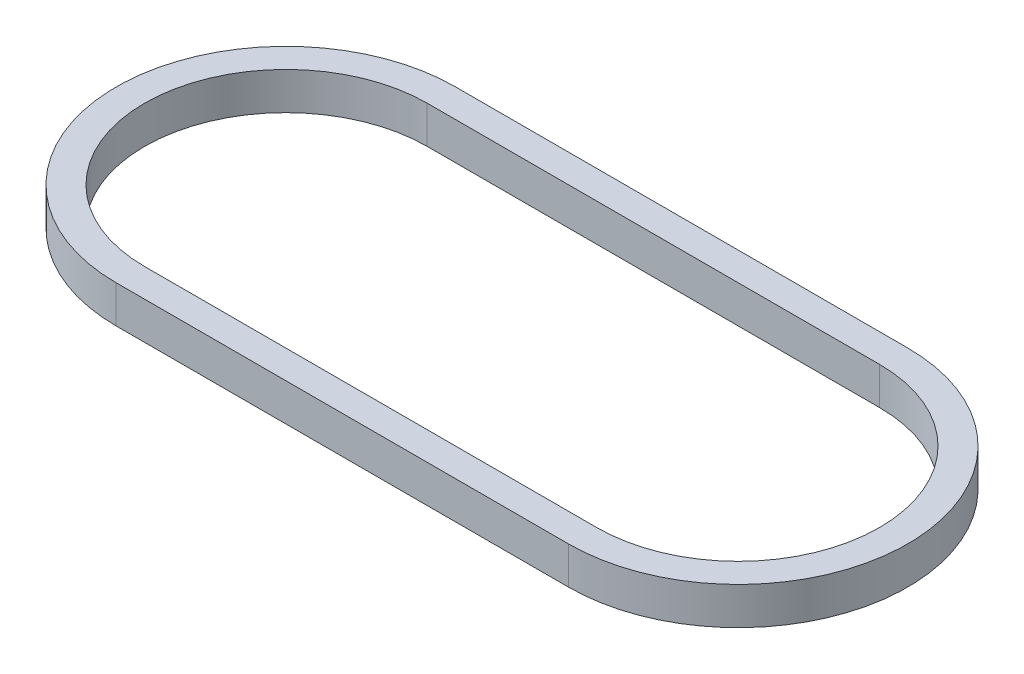
ISO-10303-21;
HEADER;
FILE_DESCRIPTION(('STEP AP214'),'2;1');
FILE_NAME('part.step','',(''),(''),'','','');
FILE_SCHEMA(('AUTOMOTIVE_DESIGN { 1 0 10303 214 1 1 1 1 }'));
ENDSEC;
DATA;
#1=APPLICATION_CONTEXT('core data for automotive mechanical design processes');
#2=APPLICATION_PROTOCOL_DEFINITION('international standard','automotive_design',2000,#1);
#3=PRODUCT_CONTEXT('',#1,'mechanical');
#4=PRODUCT('Part','Part','',(#3));
#5=PRODUCT_RELATED_PRODUCT_CATEGORY('part','',(#4));
#6=PRODUCT_DEFINITION_FORMATION('','',#4);
#7=PRODUCT_DEFINITION_CONTEXT('part definition',#1,'design');
#8=PRODUCT_DEFINITION('design','',#6,#7);
#9=PRODUCT_DEFINITION_SHAPE('','',#8);
#10=(LENGTH_UNIT() NAMED_UNIT(*) SI_UNIT(.MILLI.,.METRE.));
#11=(NAMED_UNIT(*) PLANE_ANGLE_UNIT() SI_UNIT($,.RADIAN.));
#12=(NAMED_UNIT(*) SI_UNIT($,.STERADIAN.) SOLID_ANGLE_UNIT());
#13=UNCERTAINTY_MEASURE_WITH_UNIT(LENGTH_MEASURE(1.E-05),#10,'distance_accuracy_value','');
#14=(GEOMETRIC_REPRESENTATION_CONTEXT(3) GLOBAL_UNCERTAINTY_ASSIGNED_CONTEXT((#13)) GLOBAL_UNIT_ASSIGNED_CONTEXT((#10,
#11,#12)) REPRESENTATION_CONTEXT('',''));
#15=CARTESIAN_POINT('',(0.,0.,0.));
#16=DIRECTION('',(0.,0.,1.));
#17=DIRECTION('',(1.,0.,0.));
#18=AXIS2_PLACEMENT_3D('',#15,#16,#17);
#19=CARTESIAN_POINT('',(0.,7.7978,35.3387000000112));
#20=DIRECTION('',(0.,0.,-1.));
#21=DIRECTION('',(-1.,0.,0.));
#22=AXIS2_PLACEMENT_3D('',#19,#20,#21);
#23=PLANE('',#22);
#24=DIRECTION('',(1.,0.,0.));
#25=VECTOR('',#24,1.);
#26=CARTESIAN_POINT('',(0.,0.,35.3387000000112));
#27=LINE('',#26,#25);
#28=CARTESIAN_POINT('',(-47.1,0.,35.3387000000112));
#29=VERTEX_POINT('',#28);
#30=CARTESIAN_POINT('',(47.1,0.,35.3387000000112));
#31=VERTEX_POINT('',#30);
#32=EDGE_CURVE('E165',#29,#31,#27,.T.);
#33=ORIENTED_EDGE('',*,*,#32,.T.);
#34=DIRECTION('',(0.,-1.,0.));
#35=VECTOR('',#34,1.);
#36=CARTESIAN_POINT('',(47.1,7.7978,35.3387000000112));
#37=LINE('',#36,#35);
#38=CARTESIAN_POINT('',(47.1,7.7978,35.3387000000112));
#39=VERTEX_POINT('',#38);
#40=EDGE_CURVE('E11',#39,#31,#37,.T.);
#41=ORIENTED_EDGE('',*,*,#40,.F.);
#42=DIRECTION('',(1.,0.,0.));
#43=VECTOR('',#42,1.);
#44=CARTESIAN_POINT('',(0.,7.7978,35.3387000000112));
#45=LINE('',#44,#43);
#46=CARTESIAN_POINT('',(-47.1,7.7978,35.3387000000112));
#47=VERTEX_POINT('',#46);
#48=EDGE_CURVE('E129',#47,#39,#45,.T.);
#49=ORIENTED_EDGE('',*,*,#48,.F.);
#50=DIRECTION('',(0.,-1.,0.));
#51=VECTOR('',#50,1.);
#52=CARTESIAN_POINT('',(-47.1,7.7978,35.3387000000112));
#53=LINE('',#52,#51);
#54=EDGE_CURVE('E173',#47,#29,#53,.T.);
#55=ORIENTED_EDGE('',*,*,#54,.T.);
#56=EDGE_LOOP('',(#33,#41,#49,#55));
#57=FACE_BOUND('',#56,.T.);
#58=ADVANCED_FACE('F51',(#57),#23,.F.);
#59=CARTESIAN_POINT('',(47.1,7.7978,0.));
#60=DIRECTION('',(0.,-1.,0.));
#61=DIRECTION('',(0.,0.,-1.));
#62=AXIS2_PLACEMENT_3D('',#59,#60,#61);
#63=CYLINDRICAL_SURFACE('',#62,35.3387000000112);
#64=CARTESIAN_POINT('',(47.1,0.,0.));
#65=DIRECTION('',(0.,1.,0.));
#66=DIRECTION('',(0.,0.,1.));
#67=AXIS2_PLACEMENT_3D('',#64,#65,#66);
#68=CIRCLE('',#67,35.3387000000112);
#69=CARTESIAN_POINT('',(47.1,0.,-35.3387000000112));
#70=VERTEX_POINT('',#69);
#71=EDGE_CURVE('E136',#31,#70,#68,.T.);
#72=ORIENTED_EDGE('',*,*,#71,.T.);
#73=DIRECTION('',(0.,-1.,0.));
#74=VECTOR('',#73,1.);
#75=CARTESIAN_POINT('',(47.1,7.7978,-35.3387000000112));
#76=LINE('',#75,#74);
#77=CARTESIAN_POINT('',(47.1,7.7978,-35.3387000000112));
#78=VERTEX_POINT('',#77);
#79=EDGE_CURVE('E62',#78,#70,#76,.T.);
#80=ORIENTED_EDGE('',*,*,#79,.F.);
#81=CARTESIAN_POINT('',(47.1,7.7978,0.));
#82=DIRECTION('',(0.,1.,0.));
#83=DIRECTION('',(0.,0.,1.));
#84=AXIS2_PLACEMENT_3D('',#81,#82,#83);
#85=CIRCLE('',#84,35.3387000000112);
#86=EDGE_CURVE('E123',#39,#78,#85,.T.);
#87=ORIENTED_EDGE('',*,*,#86,.F.);
#88=ORIENTED_EDGE('',*,*,#40,.T.);
#89=EDGE_LOOP('',(#72,#80,#87,#88));
#90=FACE_BOUND('',#89,.T.);
#91=ADVANCED_FACE('F135',(#90),#63,.T.);
#92=CARTESIAN_POINT('',(0.,7.7978,-35.3387000000112));
#93=DIRECTION('',(0.,0.,-1.));
#94=DIRECTION('',(-1.,0.,0.));
#95=AXIS2_PLACEMENT_3D('',#92,#93,#94);
#96=PLANE('',#95);
#97=DIRECTION('',(1.,0.,0.));
#98=VECTOR('',#97,1.);
#99=CARTESIAN_POINT('',(0.,0.,-35.3387000000112));
#100=LINE('',#99,#98);
#101=CARTESIAN_POINT('',(-47.1,0.,-35.3387000000112));
#102=VERTEX_POINT('',#101);
#103=EDGE_CURVE('E169',#102,#70,#100,.T.);
#104=ORIENTED_EDGE('',*,*,#103,.F.);
#105=DIRECTION('',(0.,-1.,0.));
#106=VECTOR('',#105,1.);
#107=CARTESIAN_POINT('',(-47.1,7.7978,-35.3387000000112));
#108=LINE('',#107,#106);
#109=CARTESIAN_POINT('',(-47.1,7.7978,-35.3387000000112));
#110=VERTEX_POINT('',#109);
#111=EDGE_CURVE('E99',#110,#102,#108,.T.);
#112=ORIENTED_EDGE('',*,*,#111,.F.);
#113=DIRECTION('',(1.,0.,0.));
#114=VECTOR('',#113,1.);
#115=CARTESIAN_POINT('',(0.,7.7978,-35.3387000000112));
#116=LINE('',#115,#114);
#117=EDGE_CURVE('E127',#110,#78,#116,.T.);
#118=ORIENTED_EDGE('',*,*,#117,.T.);
#119=ORIENTED_EDGE('',*,*,#79,.T.);
#120=EDGE_LOOP('',(#104,#112,#118,#119));
#121=FACE_BOUND('',#120,.T.);
#122=ADVANCED_FACE('F141',(#121),#96,.T.);
#123=CARTESIAN_POINT('',(47.1,7.7978,0.));
#124=DIRECTION('',(0.,-1.,0.));
#125=DIRECTION('',(0.,0.,-1.));
#126=AXIS2_PLACEMENT_3D('',#123,#124,#125);
#127=CYLINDRICAL_SURFACE('',#126,29.4458999999888);
#128=CARTESIAN_POINT('',(47.1,0.,0.));
#129=DIRECTION('',(0.,1.,0.));
#130=DIRECTION('',(0.,0.,1.));
#131=AXIS2_PLACEMENT_3D('',#128,#129,#130);
#132=CIRCLE('',#131,29.4458999999888);
#133=CARTESIAN_POINT('',(47.1,0.,29.4458999999888));
#134=VERTEX_POINT('',#133);
#135=CARTESIAN_POINT('',(47.1,0.,-29.4458999999888));
#136=VERTEX_POINT('',#135);
#137=EDGE_CURVE('E151',#134,#136,#132,.T.);
#138=ORIENTED_EDGE('',*,*,#137,.F.);
#139=DIRECTION('',(0.,-1.,0.));
#140=VECTOR('',#139,1.);
#141=CARTESIAN_POINT('',(47.1,7.7978,29.4458999999888));
#142=LINE('',#141,#140);
#143=CARTESIAN_POINT('',(47.1,7.7978,29.4458999999888));
#144=VERTEX_POINT('',#143);
#145=EDGE_CURVE('E55',#144,#134,#142,.T.);
#146=ORIENTED_EDGE('',*,*,#145,.F.);
#147=CARTESIAN_POINT('',(47.1,7.7978,0.));
#148=DIRECTION('',(0.,1.,0.));
#149=DIRECTION('',(0.,0.,1.));
#150=AXIS2_PLACEMENT_3D('',#147,#148,#149);
#151=CIRCLE('',#150,29.4458999999888);
#152=CARTESIAN_POINT('',(47.1,7.7978,-29.4458999999888));
#153=VERTEX_POINT('',#152);
#154=EDGE_CURVE('E172',#144,#153,#151,.T.);
#155=ORIENTED_EDGE('',*,*,#154,.T.);
#156=DIRECTION('',(0.,-1.,0.));
#157=VECTOR('',#156,1.);
#158=CARTESIAN_POINT('',(47.1,7.7978,-29.4458999999888));
#159=LINE('',#158,#157);
#160=EDGE_CURVE('E147',#153,#136,#159,.T.);
#161=ORIENTED_EDGE('',*,*,#160,.T.);
#162=EDGE_LOOP('',(#138,#146,#155,#161));
#163=FACE_BOUND('',#162,.T.);
#164=ADVANCED_FACE('F53',(#163),#127,.F.);
#165=CARTESIAN_POINT('',(0.,7.7978,29.4458999999888));
#166=DIRECTION('',(0.,0.,-1.));
#167=DIRECTION('',(-1.,0.,0.));
#168=AXIS2_PLACEMENT_3D('',#165,#166,#167);
#169=PLANE('',#168);
#170=DIRECTION('',(1.,0.,0.));
#171=VECTOR('',#170,1.);
#172=CARTESIAN_POINT('',(0.,0.,29.4458999999888));
#173=LINE('',#172,#171);
#174=CARTESIAN_POINT('',(-47.1,0.,29.4458999999888));
#175=VERTEX_POINT('',#174);
#176=EDGE_CURVE('E155',#175,#134,#173,.T.);
#177=ORIENTED_EDGE('',*,*,#176,.F.);
#178=DIRECTION('',(0.,-1.,0.));
#179=VECTOR('',#178,1.);
#180=CARTESIAN_POINT('',(-47.1,7.7978,29.4458999999888));
#181=LINE('',#180,#179);
#182=CARTESIAN_POINT('',(-47.1,7.7978,29.4458999999888));
#183=VERTEX_POINT('',#182);
#184=EDGE_CURVE('E178',#183,#175,#181,.T.);
#185=ORIENTED_EDGE('',*,*,#184,.F.);
#186=DIRECTION('',(1.,0.,0.));
#187=VECTOR('',#186,1.);
#188=CARTESIAN_POINT('',(0.,7.7978,29.4458999999888));
#189=LINE('',#188,#187);
#190=EDGE_CURVE('E190',#183,#144,#189,.T.);
#191=ORIENTED_EDGE('',*,*,#190,.T.);
#192=ORIENTED_EDGE('',*,*,#145,.T.);
#193=EDGE_LOOP('',(#177,#185,#191,#192));
#194=FACE_BOUND('',#193,.T.);
#195=ADVANCED_FACE('F188',(#194),#169,.T.);
#196=CARTESIAN_POINT('',(-47.1,7.7978,0.));
#197=DIRECTION('',(0.,-1.,0.));
#198=DIRECTION('',(0.,0.,-1.));
#199=AXIS2_PLACEMENT_3D('',#196,#197,#198);
#200=CYLINDRICAL_SURFACE('',#199,29.4458999999888);
#201=CARTESIAN_POINT('',(-47.1,0.,0.));
#202=DIRECTION('',(0.,1.,0.));
#203=DIRECTION('',(0.,0.,1.));
#204=AXIS2_PLACEMENT_3D('',#201,#202,#203);
#205=CIRCLE('',#204,29.4458999999888);
#206=CARTESIAN_POINT('',(-47.1,0.,-29.4458999999888));
#207=VERTEX_POINT('',#206);
#208=EDGE_CURVE('E158',#207,#175,#205,.T.);
#209=ORIENTED_EDGE('',*,*,#208,.F.);
#210=DIRECTION('',(0.,-1.,0.));
#211=VECTOR('',#210,1.);
#212=CARTESIAN_POINT('',(-47.1,7.7978,-29.4458999999888));
#213=LINE('',#212,#211);
#214=CARTESIAN_POINT('',(-47.1,7.7978,-29.4458999999888));
#215=VERTEX_POINT('',#214);
#216=EDGE_CURVE('E177',#215,#207,#213,.T.);
#217=ORIENTED_EDGE('',*,*,#216,.F.);
#218=CARTESIAN_POINT('',(-47.1,7.7978,0.));
#219=DIRECTION('',(0.,1.,0.));
#220=DIRECTION('',(0.,0.,1.));
#221=AXIS2_PLACEMENT_3D('',#218,#219,#220);
#222=CIRCLE('',#221,29.4458999999888);
#223=EDGE_CURVE('E199',#215,#183,#222,.T.);
#224=ORIENTED_EDGE('',*,*,#223,.T.);
#225=ORIENTED_EDGE('',*,*,#184,.T.);
#226=EDGE_LOOP('',(#209,#217,#224,#225));
#227=FACE_BOUND('',#226,.T.);
#228=ADVANCED_FACE('F196',(#227),#200,.F.);
#229=CARTESIAN_POINT('',(0.,7.7978,-29.4458999999888));
#230=DIRECTION('',(0.,0.,-1.));
#231=DIRECTION('',(-1.,0.,0.));
#232=AXIS2_PLACEMENT_3D('',#229,#230,#231);
#233=PLANE('',#232);
#234=DIRECTION('',(1.,0.,0.));
#235=VECTOR('',#234,1.);
#236=CARTESIAN_POINT('',(0.,0.,-29.4458999999888));
#237=LINE('',#236,#235);
#238=EDGE_CURVE('E161',#207,#136,#237,.T.);
#239=ORIENTED_EDGE('',*,*,#238,.T.);
#240=ORIENTED_EDGE('',*,*,#160,.F.);
#241=DIRECTION('',(1.,0.,0.));
#242=VECTOR('',#241,1.);
#243=CARTESIAN_POINT('',(0.,7.7978,-29.4458999999888));
#244=LINE('',#243,#242);
#245=EDGE_CURVE('E201',#215,#153,#244,.T.);
#246=ORIENTED_EDGE('',*,*,#245,.F.);
#247=ORIENTED_EDGE('',*,*,#216,.T.);
#248=EDGE_LOOP('',(#239,#240,#246,#247));
#249=FACE_BOUND('',#248,.T.);
#250=ADVANCED_FACE('F202',(#249),#233,.F.);
#251=CARTESIAN_POINT('',(-47.1,7.7978,0.));
#252=DIRECTION('',(0.,-1.,0.));
#253=DIRECTION('',(0.,0.,-1.));
#254=AXIS2_PLACEMENT_3D('',#251,#252,#253);
#255=CYLINDRICAL_SURFACE('',#254,35.3387000000112);
#256=CARTESIAN_POINT('',(-47.1,0.,0.));
#257=DIRECTION('',(0.,1.,0.));
#258=DIRECTION('',(0.,0.,1.));
#259=AXIS2_PLACEMENT_3D('',#256,#257,#258);
#260=CIRCLE('',#259,35.3387000000112);
#261=EDGE_CURVE('E102',#102,#29,#260,.T.);
#262=ORIENTED_EDGE('',*,*,#261,.T.);
#263=ORIENTED_EDGE('',*,*,#54,.F.);
#264=CARTESIAN_POINT('',(-47.1,7.7978,0.));
#265=DIRECTION('',(0.,1.,0.));
#266=DIRECTION('',(0.,0.,1.));
#267=AXIS2_PLACEMENT_3D('',#264,#265,#266);
#268=CIRCLE('',#267,35.3387000000112);
#269=EDGE_CURVE('E71',#110,#47,#268,.T.);
#270=ORIENTED_EDGE('',*,*,#269,.F.);
#271=ORIENTED_EDGE('',*,*,#111,.T.);
#272=EDGE_LOOP('',(#262,#263,#270,#271));
#273=FACE_BOUND('',#272,.T.);
#274=ADVANCED_FACE('F214',(#273),#255,.T.);
#275=CARTESIAN_POINT('',(0.,7.7978,0.));
#276=DIRECTION('',(0.,1.,0.));
#277=DIRECTION('',(0.,0.,1.));
#278=AXIS2_PLACEMENT_3D('',#275,#276,#277);
#279=PLANE('',#278);
#280=ORIENTED_EDGE('',*,*,#154,.F.);
#281=ORIENTED_EDGE('',*,*,#190,.F.);
#282=ORIENTED_EDGE('',*,*,#223,.F.);
#283=ORIENTED_EDGE('',*,*,#245,.T.);
#284=EDGE_LOOP('',(#280,#281,#282,#283));
#285=FACE_BOUND('',#284,.T.);
#286=ORIENTED_EDGE('',*,*,#48,.T.);
#287=ORIENTED_EDGE('',*,*,#86,.T.);
#288=ORIENTED_EDGE('',*,*,#117,.F.);
#289=ORIENTED_EDGE('',*,*,#269,.T.);
#290=EDGE_LOOP('',(#286,#287,#288,#289));
#291=FACE_BOUND('',#290,.T.);
#292=ADVANCED_FACE('F125',(#285,#291),#279,.T.);
#293=CARTESIAN_POINT('',(0.,0.,0.));
#294=DIRECTION('',(0.,1.,0.));
#295=DIRECTION('',(0.,0.,1.));
#296=AXIS2_PLACEMENT_3D('',#293,#294,#295);
#297=PLANE('',#296);
#298=ORIENTED_EDGE('',*,*,#137,.T.);
#299=ORIENTED_EDGE('',*,*,#238,.F.);
#300=ORIENTED_EDGE('',*,*,#208,.T.);
#301=ORIENTED_EDGE('',*,*,#176,.T.);
#302=EDGE_LOOP('',(#298,#299,#300,#301));
#303=FACE_BOUND('',#302,.T.);
#304=ORIENTED_EDGE('',*,*,#32,.F.);
#305=ORIENTED_EDGE('',*,*,#261,.F.);
#306=ORIENTED_EDGE('',*,*,#103,.T.);
#307=ORIENTED_EDGE('',*,*,#71,.F.);
#308=EDGE_LOOP('',(#304,#305,#306,#307));
#309=FACE_BOUND('',#308,.T.);
#310=ADVANCED_FACE('F194',(#303,#309),#297,.F.);
#311=CLOSED_SHELL('',(#58,#91,#122,#164,#195,#228,#250,#274,#292,#310));
#312=MANIFOLD_SOLID_BREP('B2',#311);
#313=ADVANCED_BREP_SHAPE_REPRESENTATION('',(#18,#312),#14);
#314=SHAPE_DEFINITION_REPRESENTATION(#9,#313);
ENDSEC;
END-ISO-10303-21;
